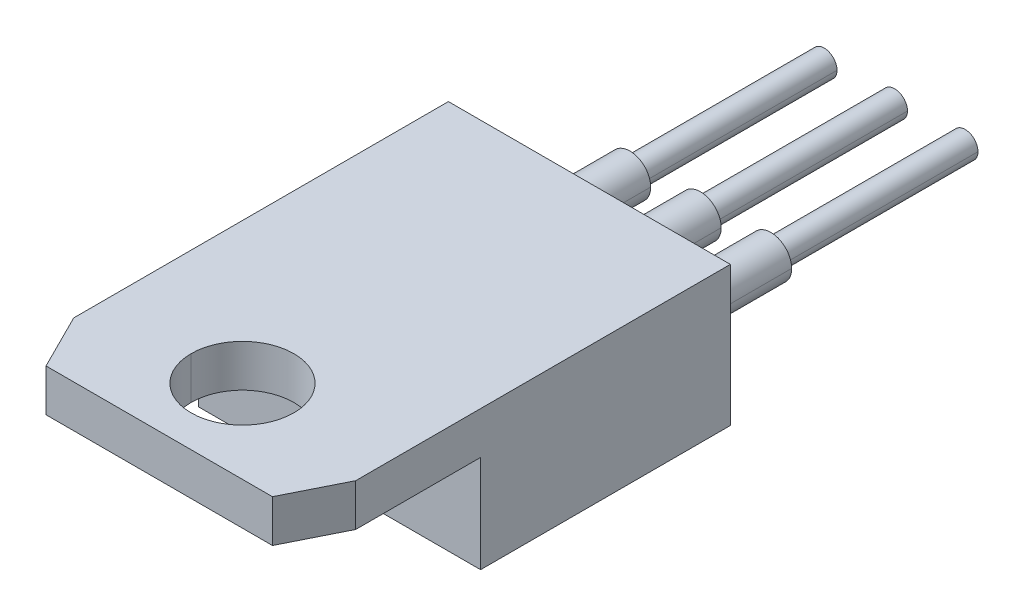
ISO-10303-21;
HEADER;
FILE_DESCRIPTION(('STEP AP214'),'2;1');
FILE_NAME('part.step','',(''),(''),'','','');
FILE_SCHEMA(('AUTOMOTIVE_DESIGN { 1 0 10303 214 1 1 1 1 }'));
ENDSEC;
DATA;
#1=APPLICATION_CONTEXT('core data for automotive mechanical design processes');
#2=APPLICATION_PROTOCOL_DEFINITION('international standard','automotive_design',2000,#1);
#3=PRODUCT_CONTEXT('',#1,'mechanical');
#4=PRODUCT('Part','Part','',(#3));
#5=PRODUCT_RELATED_PRODUCT_CATEGORY('part','',(#4));
#6=PRODUCT_DEFINITION_FORMATION('','',#4);
#7=PRODUCT_DEFINITION_CONTEXT('part definition',#1,'design');
#8=PRODUCT_DEFINITION('design','',#6,#7);
#9=PRODUCT_DEFINITION_SHAPE('','',#8);
#10=(LENGTH_UNIT() NAMED_UNIT(*) SI_UNIT(.MILLI.,.METRE.));
#11=(NAMED_UNIT(*) PLANE_ANGLE_UNIT() SI_UNIT($,.RADIAN.));
#12=(NAMED_UNIT(*) SI_UNIT($,.STERADIAN.) SOLID_ANGLE_UNIT());
#13=UNCERTAINTY_MEASURE_WITH_UNIT(LENGTH_MEASURE(1.E-05),#10,'distance_accuracy_value','');
#14=(GEOMETRIC_REPRESENTATION_CONTEXT(3) GLOBAL_UNCERTAINTY_ASSIGNED_CONTEXT((#13)) GLOBAL_UNIT_ASSIGNED_CONTEXT((#10,
#11,#12)) REPRESENTATION_CONTEXT('',''));
#15=CARTESIAN_POINT('',(0.,0.,0.));
#16=DIRECTION('',(0.,0.,1.));
#17=DIRECTION('',(1.,0.,0.));
#18=AXIS2_PLACEMENT_3D('',#15,#16,#17);
#19=CARTESIAN_POINT('',(3706.541863979,164.0918075982,-559.330297417));
#20=DIRECTION('',(0.,0.,1.));
#21=DIRECTION('',(1.,0.,0.));
#22=AXIS2_PLACEMENT_3D('',#19,#20,#21);
#23=CYLINDRICAL_SURFACE('',#22,0.75);
#24=CARTESIAN_POINT('',(3706.541863979,164.0918075982,-563.330297417));
#25=DIRECTION('',(0.,0.,1.));
#26=DIRECTION('',(-1.,-1.13686837721616E-13,0.));
#27=AXIS2_PLACEMENT_3D('',#24,#25,#26);
#28=CIRCLE('',#27,0.75);
#29=CARTESIAN_POINT('',(3705.791863979,164.0918075982,-563.330297417));
#30=VERTEX_POINT('',#29);
#31=CARTESIAN_POINT('',(3707.291863979,164.0918075982,-563.330297417));
#32=VERTEX_POINT('',#31);
#33=EDGE_CURVE('E25',#30,#32,#28,.T.);
#34=ORIENTED_EDGE('',*,*,#33,.T.);
#35=DIRECTION('',(0.,0.,1.));
#36=VECTOR('',#35,1.);
#37=CARTESIAN_POINT('',(3707.291863979,164.0918075982,-559.330297417));
#38=LINE('',#37,#36);
#39=CARTESIAN_POINT('',(3707.291863979,164.0918075982,-559.330297417));
#40=VERTEX_POINT('',#39);
#41=EDGE_CURVE('E424',#32,#40,#38,.T.);
#42=ORIENTED_EDGE('',*,*,#41,.T.);
#43=CARTESIAN_POINT('',(3706.541863979,164.0918075982,-559.330297417));
#44=DIRECTION('',(0.,0.,-1.));
#45=DIRECTION('',(1.,-1.13686837721616E-13,0.));
#46=AXIS2_PLACEMENT_3D('',#43,#44,#45);
#47=CIRCLE('',#46,0.75);
#48=CARTESIAN_POINT('',(3705.791863979,164.0918075982,-559.330297417));
#49=VERTEX_POINT('',#48);
#50=EDGE_CURVE('E359',#40,#49,#47,.T.);
#51=ORIENTED_EDGE('',*,*,#50,.T.);
#52=DIRECTION('',(0.,0.,1.));
#53=VECTOR('',#52,1.);
#54=CARTESIAN_POINT('',(3705.791863979,164.0918075982,-559.330297417));
#55=LINE('',#54,#53);
#56=EDGE_CURVE('E352',#30,#49,#55,.T.);
#57=ORIENTED_EDGE('',*,*,#56,.F.);
#58=EDGE_LOOP('',(#34,#42,#51,#57));
#59=FACE_BOUND('',#58,.T.);
#60=ADVANCED_FACE('F16',(#59),#23,.T.);
#61=CARTESIAN_POINT('',(3706.541863979,165.5904075982,-546.830297417));
#62=DIRECTION('',(0.,-1.,0.));
#63=DIRECTION('',(1.,0.,0.));
#64=AXIS2_PLACEMENT_3D('',#61,#62,#63);
#65=CYLINDRICAL_SURFACE('',#64,1.85);
#66=CARTESIAN_POINT('',(3706.541863979,167.1144075982,-546.830297417));
#67=DIRECTION('',(0.,1.,0.));
#68=DIRECTION('',(1.,0.,0.));
#69=AXIS2_PLACEMENT_3D('',#66,#67,#68);
#70=CIRCLE('',#69,1.85);
#71=CARTESIAN_POINT('',(3704.691863979,167.1144075982,-546.830297417));
#72=VERTEX_POINT('',#71);
#73=CARTESIAN_POINT('',(3708.391863979,167.1144075982,-546.830297417));
#74=VERTEX_POINT('',#73);
#75=EDGE_CURVE('E263',#72,#74,#70,.T.);
#76=ORIENTED_EDGE('',*,*,#75,.T.);
#77=DIRECTION('',(0.,-1.,0.));
#78=VECTOR('',#77,1.);
#79=CARTESIAN_POINT('',(3708.391863979,165.5904075982,-546.830297417));
#80=LINE('',#79,#78);
#81=CARTESIAN_POINT('',(3708.391863979,165.5904075982,-546.830297417));
#82=VERTEX_POINT('',#81);
#83=EDGE_CURVE('E318',#74,#82,#80,.T.);
#84=ORIENTED_EDGE('',*,*,#83,.T.);
#85=CARTESIAN_POINT('',(3706.541863979,165.5904075982,-546.830297417));
#86=DIRECTION('',(0.,-1.,0.));
#87=DIRECTION('',(-1.,0.,0.));
#88=AXIS2_PLACEMENT_3D('',#85,#86,#87);
#89=CIRCLE('',#88,1.85);
#90=CARTESIAN_POINT('',(3704.691863979,165.5904075982,-546.830297417));
#91=VERTEX_POINT('',#90);
#92=EDGE_CURVE('E308',#82,#91,#89,.T.);
#93=ORIENTED_EDGE('',*,*,#92,.T.);
#94=DIRECTION('',(0.,-1.,0.));
#95=VECTOR('',#94,1.);
#96=CARTESIAN_POINT('',(3704.691863979,165.5904075982,-546.830297417));
#97=LINE('',#96,#95);
#98=EDGE_CURVE('E314',#72,#91,#97,.T.);
#99=ORIENTED_EDGE('',*,*,#98,.F.);
#100=EDGE_LOOP('',(#76,#84,#93,#99));
#101=FACE_BOUND('',#100,.T.);
#102=ADVANCED_FACE('F457',(#101),#65,.F.);
#103=CARTESIAN_POINT('',(3704.001863979,164.0918075982,-559.330297417));
#104=DIRECTION('',(0.,0.,1.));
#105=DIRECTION('',(1.,0.,0.));
#106=AXIS2_PLACEMENT_3D('',#103,#104,#105);
#107=CYLINDRICAL_SURFACE('',#106,0.75);
#108=DIRECTION('',(0.,0.,1.));
#109=VECTOR('',#108,1.);
#110=CARTESIAN_POINT('',(3704.751863979,164.0918075982,-559.330297417));
#111=LINE('',#110,#109);
#112=CARTESIAN_POINT('',(3704.751863979,164.0918075982,-563.330297417));
#113=VERTEX_POINT('',#112);
#114=CARTESIAN_POINT('',(3704.751863979,164.0918075982,-559.330297417));
#115=VERTEX_POINT('',#114);
#116=EDGE_CURVE('E300',#113,#115,#111,.T.);
#117=ORIENTED_EDGE('',*,*,#116,.F.);
#118=CARTESIAN_POINT('',(3704.001863979,164.0918075982,-563.330297417));
#119=DIRECTION('',(0.,0.,1.));
#120=DIRECTION('',(-1.,-1.13686837721616E-13,0.));
#121=AXIS2_PLACEMENT_3D('',#118,#119,#120);
#122=CIRCLE('',#121,0.75);
#123=CARTESIAN_POINT('',(3703.251863979,164.0918075982,-563.330297417));
#124=VERTEX_POINT('',#123);
#125=EDGE_CURVE('E286',#113,#124,#122,.T.);
#126=ORIENTED_EDGE('',*,*,#125,.T.);
#127=DIRECTION('',(0.,0.,1.));
#128=VECTOR('',#127,1.);
#129=CARTESIAN_POINT('',(3703.251863979,164.0918075982,-559.330297417));
#130=LINE('',#129,#128);
#131=CARTESIAN_POINT('',(3703.251863979,164.0918075982,-559.330297417));
#132=VERTEX_POINT('',#131);
#133=EDGE_CURVE('E317',#124,#132,#130,.T.);
#134=ORIENTED_EDGE('',*,*,#133,.T.);
#135=CARTESIAN_POINT('',(3704.001863979,164.0918075982,-559.330297417));
#136=DIRECTION('',(0.,0.,-1.));
#137=DIRECTION('',(1.,-1.13686837721616E-13,0.));
#138=AXIS2_PLACEMENT_3D('',#135,#136,#137);
#139=CIRCLE('',#138,0.75);
#140=EDGE_CURVE('E351',#132,#115,#139,.T.);
#141=ORIENTED_EDGE('',*,*,#140,.T.);
#142=EDGE_LOOP('',(#117,#126,#134,#141));
#143=FACE_BOUND('',#142,.T.);
#144=ADVANCED_FACE('F462',(#143),#107,.T.);
#145=CARTESIAN_POINT('',(3709.081863979,164.0918075982,-559.330297417));
#146=DIRECTION('',(0.,0.,1.));
#147=DIRECTION('',(1.,0.,0.));
#148=AXIS2_PLACEMENT_3D('',#145,#146,#147);
#149=CYLINDRICAL_SURFACE('',#148,0.75);
#150=CARTESIAN_POINT('',(3709.081863979,164.0918075982,-563.330297417));
#151=DIRECTION('',(0.,0.,1.));
#152=DIRECTION('',(-1.,-1.13686837721616E-13,0.));
#153=AXIS2_PLACEMENT_3D('',#150,#151,#152);
#154=CIRCLE('',#153,0.75);
#155=CARTESIAN_POINT('',(3708.331863979,164.0918075982,-563.330297417));
#156=VERTEX_POINT('',#155);
#157=CARTESIAN_POINT('',(3709.831863979,164.0918075982,-563.330297417));
#158=VERTEX_POINT('',#157);
#159=EDGE_CURVE('E273',#156,#158,#154,.T.);
#160=ORIENTED_EDGE('',*,*,#159,.T.);
#161=DIRECTION('',(0.,0.,1.));
#162=VECTOR('',#161,1.);
#163=CARTESIAN_POINT('',(3709.831863979,164.0918075982,-559.330297417));
#164=LINE('',#163,#162);
#165=CARTESIAN_POINT('',(3709.831863979,164.0918075982,-559.330297417));
#166=VERTEX_POINT('',#165);
#167=EDGE_CURVE('E364',#158,#166,#164,.T.);
#168=ORIENTED_EDGE('',*,*,#167,.T.);
#169=CARTESIAN_POINT('',(3709.081863979,164.0918075982,-559.330297417));
#170=DIRECTION('',(0.,0.,-1.));
#171=DIRECTION('',(1.,-1.13686837721616E-13,0.));
#172=AXIS2_PLACEMENT_3D('',#169,#170,#171);
#173=CIRCLE('',#172,0.75);
#174=CARTESIAN_POINT('',(3708.331863979,164.0918075982,-559.330297417));
#175=VERTEX_POINT('',#174);
#176=EDGE_CURVE('E343',#166,#175,#173,.T.);
#177=ORIENTED_EDGE('',*,*,#176,.T.);
#178=DIRECTION('',(0.,0.,1.));
#179=VECTOR('',#178,1.);
#180=CARTESIAN_POINT('',(3708.331863979,164.0918075982,-559.330297417));
#181=LINE('',#180,#179);
#182=EDGE_CURVE('E277',#156,#175,#181,.T.);
#183=ORIENTED_EDGE('',*,*,#182,.F.);
#184=EDGE_LOOP('',(#160,#168,#177,#183));
#185=FACE_BOUND('',#184,.T.);
#186=ADVANCED_FACE('F468',(#185),#149,.T.);
#187=CARTESIAN_POINT('',(3706.541863979,164.0918075982,-559.330297417));
#188=DIRECTION('',(0.,0.,1.));
#189=DIRECTION('',(1.,0.,0.));
#190=AXIS2_PLACEMENT_3D('',#187,#188,#189);
#191=CYLINDRICAL_SURFACE('',#190,0.4635500000001);
#192=DIRECTION('',(0.,0.,1.));
#193=VECTOR('',#192,1.);
#194=CARTESIAN_POINT('',(3707.005413979,164.0918075982,-559.330297417));
#195=LINE('',#194,#193);
#196=CARTESIAN_POINT('',(3707.005413979,164.0918075982,-570.330297417));
#197=VERTEX_POINT('',#196);
#198=CARTESIAN_POINT('',(3707.005413979,164.0918075982,-563.330297417));
#199=VERTEX_POINT('',#198);
#200=EDGE_CURVE('E392',#197,#199,#195,.T.);
#201=ORIENTED_EDGE('',*,*,#200,.T.);
#202=CARTESIAN_POINT('',(3706.541863979,164.0918075982,-563.330297417));
#203=DIRECTION('',(0.,0.,-1.));
#204=DIRECTION('',(1.,-1.83939441896716E-13,0.));
#205=AXIS2_PLACEMENT_3D('',#202,#203,#204);
#206=CIRCLE('',#205,0.4635500000001);
#207=CARTESIAN_POINT('',(3706.078313979,164.0918075982,-563.330297417));
#208=VERTEX_POINT('',#207);
#209=EDGE_CURVE('E10',#199,#208,#206,.T.);
#210=ORIENTED_EDGE('',*,*,#209,.T.);
#211=DIRECTION('',(0.,0.,1.));
#212=VECTOR('',#211,1.);
#213=CARTESIAN_POINT('',(3706.078313979,164.0918075982,-559.330297417));
#214=LINE('',#213,#212);
#215=CARTESIAN_POINT('',(3706.078313979,164.0918075982,-570.330297417));
#216=VERTEX_POINT('',#215);
#217=EDGE_CURVE('E384',#216,#208,#214,.T.);
#218=ORIENTED_EDGE('',*,*,#217,.F.);
#219=CARTESIAN_POINT('',(3706.541863979,164.0918075982,-570.330297417));
#220=DIRECTION('',(0.,0.,1.));
#221=DIRECTION('',(-1.,-1.83939441896716E-13,0.));
#222=AXIS2_PLACEMENT_3D('',#219,#220,#221);
#223=CIRCLE('',#222,0.4635500000001);
#224=EDGE_CURVE('E271',#216,#197,#223,.T.);
#225=ORIENTED_EDGE('',*,*,#224,.T.);
#226=EDGE_LOOP('',(#201,#210,#218,#225));
#227=FACE_BOUND('',#226,.T.);
#228=ADVANCED_FACE('F472',(#227),#191,.T.);
#229=CARTESIAN_POINT('',(3704.001863979,164.0918075982,-559.330297417));
#230=DIRECTION('',(0.,0.,1.));
#231=DIRECTION('',(1.,0.,0.));
#232=AXIS2_PLACEMENT_3D('',#229,#230,#231);
#233=CYLINDRICAL_SURFACE('',#232,0.4635500000001);
#234=CARTESIAN_POINT('',(3704.001863979,164.0918075982,-570.330297417));
#235=DIRECTION('',(0.,0.,1.));
#236=DIRECTION('',(-1.,-1.83939441896716E-13,0.));
#237=AXIS2_PLACEMENT_3D('',#234,#235,#236);
#238=CIRCLE('',#237,0.4635500000001);
#239=CARTESIAN_POINT('',(3703.538313979,164.0918075982,-570.330297417));
#240=VERTEX_POINT('',#239);
#241=CARTESIAN_POINT('',(3704.465413979,164.0918075982,-570.330297417));
#242=VERTEX_POINT('',#241);
#243=EDGE_CURVE('E268',#240,#242,#238,.T.);
#244=ORIENTED_EDGE('',*,*,#243,.T.);
#245=DIRECTION('',(0.,0.,1.));
#246=VECTOR('',#245,1.);
#247=CARTESIAN_POINT('',(3704.465413979,164.0918075982,-559.330297417));
#248=LINE('',#247,#246);
#249=CARTESIAN_POINT('',(3704.465413979,164.0918075982,-563.330297417));
#250=VERTEX_POINT('',#249);
#251=EDGE_CURVE('E416',#242,#250,#248,.T.);
#252=ORIENTED_EDGE('',*,*,#251,.T.);
#253=CARTESIAN_POINT('',(3704.001863979,164.0918075982,-563.330297417));
#254=DIRECTION('',(0.,0.,-1.));
#255=DIRECTION('',(1.,-1.83939441896716E-13,0.));
#256=AXIS2_PLACEMENT_3D('',#253,#254,#255);
#257=CIRCLE('',#256,0.4635500000001);
#258=CARTESIAN_POINT('',(3703.538313979,164.0918075982,-563.330297417));
#259=VERTEX_POINT('',#258);
#260=EDGE_CURVE('E285',#250,#259,#257,.T.);
#261=ORIENTED_EDGE('',*,*,#260,.T.);
#262=DIRECTION('',(0.,0.,1.));
#263=VECTOR('',#262,1.);
#264=CARTESIAN_POINT('',(3703.538313979,164.0918075982,-559.330297417));
#265=LINE('',#264,#263);
#266=EDGE_CURVE('E272',#240,#259,#265,.T.);
#267=ORIENTED_EDGE('',*,*,#266,.F.);
#268=EDGE_LOOP('',(#244,#252,#261,#267));
#269=FACE_BOUND('',#268,.T.);
#270=ADVANCED_FACE('F451',(#269),#233,.T.);
#271=CARTESIAN_POINT('',(3709.081863979,164.0918075982,-559.330297417));
#272=DIRECTION('',(0.,0.,1.));
#273=DIRECTION('',(1.,0.,0.));
#274=AXIS2_PLACEMENT_3D('',#271,#272,#273);
#275=CYLINDRICAL_SURFACE('',#274,0.4635500000001);
#276=DIRECTION('',(0.,0.,1.));
#277=VECTOR('',#276,1.);
#278=CARTESIAN_POINT('',(3709.545413979,164.0918075982,-559.330297417));
#279=LINE('',#278,#277);
#280=CARTESIAN_POINT('',(3709.545413979,164.0918075982,-570.330297417));
#281=VERTEX_POINT('',#280);
#282=CARTESIAN_POINT('',(3709.545413979,164.0918075982,-563.330297417));
#283=VERTEX_POINT('',#282);
#284=EDGE_CURVE('E372',#281,#283,#279,.T.);
#285=ORIENTED_EDGE('',*,*,#284,.T.);
#286=CARTESIAN_POINT('',(3709.081863979,164.0918075982,-563.330297417));
#287=DIRECTION('',(0.,0.,-1.));
#288=DIRECTION('',(1.,-1.83939441896716E-13,0.));
#289=AXIS2_PLACEMENT_3D('',#286,#287,#288);
#290=CIRCLE('',#289,0.4635500000001);
#291=CARTESIAN_POINT('',(3708.618313979,164.0918075982,-563.330297417));
#292=VERTEX_POINT('',#291);
#293=EDGE_CURVE('E376',#283,#292,#290,.T.);
#294=ORIENTED_EDGE('',*,*,#293,.T.);
#295=DIRECTION('',(0.,0.,1.));
#296=VECTOR('',#295,1.);
#297=CARTESIAN_POINT('',(3708.618313979,164.0918075982,-559.330297417));
#298=LINE('',#297,#296);
#299=CARTESIAN_POINT('',(3708.618313979,164.0918075982,-570.330297417));
#300=VERTEX_POINT('',#299);
#301=EDGE_CURVE('E371',#300,#292,#298,.T.);
#302=ORIENTED_EDGE('',*,*,#301,.F.);
#303=CARTESIAN_POINT('',(3709.081863979,164.0918075982,-570.330297417));
#304=DIRECTION('',(0.,0.,1.));
#305=DIRECTION('',(-1.,-1.83939441896716E-13,0.));
#306=AXIS2_PLACEMENT_3D('',#303,#304,#305);
#307=CIRCLE('',#306,0.4635500000001);
#308=EDGE_CURVE('E400',#300,#281,#307,.T.);
#309=ORIENTED_EDGE('',*,*,#308,.T.);
#310=EDGE_LOOP('',(#285,#294,#302,#309));
#311=FACE_BOUND('',#310,.T.);
#312=ADVANCED_FACE('F440',(#311),#275,.T.);
#313=CARTESIAN_POINT('',(339.4764262862,745.8046419631,-563.330297417));
#314=DIRECTION('',(0.,0.,1.));
#315=DIRECTION('',(1.,0.,0.));
#316=AXIS2_PLACEMENT_3D('',#313,#314,#315);
#317=PLANE('',#316);
#318=CARTESIAN_POINT('',(3706.541863979,164.0918075982,-563.330297417));
#319=DIRECTION('',(0.,0.,-1.));
#320=DIRECTION('',(1.,-1.83939441896716E-13,0.));
#321=AXIS2_PLACEMENT_3D('',#318,#319,#320);
#322=CIRCLE('',#321,0.4635500000001);
#323=EDGE_CURVE('E388',#208,#199,#322,.T.);
#324=ORIENTED_EDGE('',*,*,#323,.F.);
#325=ORIENTED_EDGE('',*,*,#209,.F.);
#326=EDGE_LOOP('',(#324,#325));
#327=FACE_BOUND('',#326,.T.);
#328=ORIENTED_EDGE('',*,*,#33,.F.);
#329=CARTESIAN_POINT('',(3706.541863979,164.0918075982,-563.330297417));
#330=DIRECTION('',(0.,0.,1.));
#331=DIRECTION('',(-1.,-1.13686837721616E-13,0.));
#332=AXIS2_PLACEMENT_3D('',#329,#330,#331);
#333=CIRCLE('',#332,0.75);
#334=EDGE_CURVE('E19',#32,#30,#333,.T.);
#335=ORIENTED_EDGE('',*,*,#334,.F.);
#336=EDGE_LOOP('',(#328,#335));
#337=FACE_BOUND('',#336,.T.);
#338=ADVANCED_FACE('F438',(#327,#337),#317,.F.);
#339=CARTESIAN_POINT('',(3706.541863979,164.0918075982,-559.330297417));
#340=DIRECTION('',(0.,0.,1.));
#341=DIRECTION('',(1.,0.,0.));
#342=AXIS2_PLACEMENT_3D('',#339,#340,#341);
#343=CYLINDRICAL_SURFACE('',#342,0.75);
#344=CARTESIAN_POINT('',(3706.541863979,164.0918075982,-559.330297417));
#345=DIRECTION('',(0.,0.,-1.));
#346=DIRECTION('',(1.,-1.13686837721616E-13,0.));
#347=AXIS2_PLACEMENT_3D('',#344,#345,#346);
#348=CIRCLE('',#347,0.75);
#349=EDGE_CURVE('E355',#49,#40,#348,.T.);
#350=ORIENTED_EDGE('',*,*,#349,.T.);
#351=ORIENTED_EDGE('',*,*,#41,.F.);
#352=ORIENTED_EDGE('',*,*,#334,.T.);
#353=ORIENTED_EDGE('',*,*,#56,.T.);
#354=EDGE_LOOP('',(#350,#351,#352,#353));
#355=FACE_BOUND('',#354,.T.);
#356=ADVANCED_FACE('F437',(#355),#343,.T.);
#357=CARTESIAN_POINT('',(339.4764262862,745.8046419631,-570.330297417));
#358=DIRECTION('',(0.,0.,1.));
#359=DIRECTION('',(1.,0.,0.));
#360=AXIS2_PLACEMENT_3D('',#357,#358,#359);
#361=PLANE('',#360);
#362=CARTESIAN_POINT('',(3706.541863979,164.0918075982,-570.330297417));
#363=DIRECTION('',(0.,0.,1.));
#364=DIRECTION('',(-1.,-1.83939441896716E-13,0.));
#365=AXIS2_PLACEMENT_3D('',#362,#363,#364);
#366=CIRCLE('',#365,0.4635500000001);
#367=EDGE_CURVE('E380',#197,#216,#366,.T.);
#368=ORIENTED_EDGE('',*,*,#367,.F.);
#369=ORIENTED_EDGE('',*,*,#224,.F.);
#370=EDGE_LOOP('',(#368,#369));
#371=FACE_BOUND('',#370,.T.);
#372=ADVANCED_FACE('F449',(#371),#361,.F.);
#373=CARTESIAN_POINT('',(339.4764262862,745.8046419631,-570.330297417));
#374=DIRECTION('',(0.,0.,1.));
#375=DIRECTION('',(1.,0.,0.));
#376=AXIS2_PLACEMENT_3D('',#373,#374,#375);
#377=PLANE('',#376);
#378=ORIENTED_EDGE('',*,*,#243,.F.);
#379=CARTESIAN_POINT('',(3704.001863979,164.0918075982,-570.330297417));
#380=DIRECTION('',(0.,0.,1.));
#381=DIRECTION('',(-1.,-1.83939441896716E-13,0.));
#382=AXIS2_PLACEMENT_3D('',#379,#380,#381);
#383=CIRCLE('',#382,0.4635500000001);
#384=EDGE_CURVE('E417',#242,#240,#383,.T.);
#385=ORIENTED_EDGE('',*,*,#384,.F.);
#386=EDGE_LOOP('',(#378,#385));
#387=FACE_BOUND('',#386,.T.);
#388=ADVANCED_FACE('F485',(#387),#377,.F.);
#389=CARTESIAN_POINT('',(3704.001863979,164.0918075982,-559.330297417));
#390=DIRECTION('',(0.,0.,1.));
#391=DIRECTION('',(1.,0.,0.));
#392=AXIS2_PLACEMENT_3D('',#389,#390,#391);
#393=CYLINDRICAL_SURFACE('',#392,0.4635500000001);
#394=CARTESIAN_POINT('',(3704.001863979,164.0918075982,-563.330297417));
#395=DIRECTION('',(0.,0.,-1.));
#396=DIRECTION('',(1.,-1.83939441896716E-13,0.));
#397=AXIS2_PLACEMENT_3D('',#394,#395,#396);
#398=CIRCLE('',#397,0.4635500000001);
#399=EDGE_CURVE('E281',#259,#250,#398,.T.);
#400=ORIENTED_EDGE('',*,*,#399,.T.);
#401=ORIENTED_EDGE('',*,*,#251,.F.);
#402=ORIENTED_EDGE('',*,*,#384,.T.);
#403=ORIENTED_EDGE('',*,*,#266,.T.);
#404=EDGE_LOOP('',(#400,#401,#402,#403));
#405=FACE_BOUND('',#404,.T.);
#406=ADVANCED_FACE('F487',(#405),#393,.T.);
#407=CARTESIAN_POINT('',(3701.961863979,166.3524075982,-544.830297417));
#408=DIRECTION('',(0.894427190999896,0.,-0.447213595499998));
#409=DIRECTION('',(0.,-1.,0.));
#410=AXIS2_PLACEMENT_3D('',#407,#408,#409);
#411=PLANE('',#410);
#412=DIRECTION('',(0.,-1.,0.));
#413=VECTOR('',#412,1.);
#414=CARTESIAN_POINT('',(3702.461863979,167.1144075982,-543.830297417));
#415=LINE('',#414,#413);
#416=CARTESIAN_POINT('',(3702.461863979,167.1144075982,-543.830297417));
#417=VERTEX_POINT('',#416);
#418=CARTESIAN_POINT('',(3702.461863979,165.5904075982,-543.830297417));
#419=VERTEX_POINT('',#418);
#420=EDGE_CURVE('E517',#417,#419,#415,.T.);
#421=ORIENTED_EDGE('',*,*,#420,.F.);
#422=DIRECTION('',(-0.447213595499938,0.,-0.894427190999926));
#423=VECTOR('',#422,1.);
#424=CARTESIAN_POINT('',(3702.461863979,167.1144075982,-543.830297417));
#425=LINE('',#424,#423);
#426=CARTESIAN_POINT('',(3701.461863979,167.1144075982,-545.830297417));
#427=VERTEX_POINT('',#426);
#428=EDGE_CURVE('E227',#417,#427,#425,.T.);
#429=ORIENTED_EDGE('',*,*,#428,.T.);
#430=DIRECTION('',(0.,-1.,0.));
#431=VECTOR('',#430,1.);
#432=CARTESIAN_POINT('',(3701.461863979,167.1144075982,-545.830297417));
#433=LINE('',#432,#431);
#434=CARTESIAN_POINT('',(3701.461863979,165.5904075982,-545.830297417));
#435=VERTEX_POINT('',#434);
#436=EDGE_CURVE('E291',#427,#435,#433,.T.);
#437=ORIENTED_EDGE('',*,*,#436,.T.);
#438=DIRECTION('',(0.447213595499938,0.,0.894427190999926));
#439=VECTOR('',#438,1.);
#440=CARTESIAN_POINT('',(3701.461863979,165.5904075982,-545.830297417));
#441=LINE('',#440,#439);
#442=EDGE_CURVE('E309',#435,#419,#441,.T.);
#443=ORIENTED_EDGE('',*,*,#442,.T.);
#444=EDGE_LOOP('',(#421,#429,#437,#443));
#445=FACE_BOUND('',#444,.T.);
#446=ADVANCED_FACE('F861',(#445),#411,.F.);
#447=CARTESIAN_POINT('',(339.4764262862,745.8046419631,-563.330297417));
#448=DIRECTION('',(0.,0.,1.));
#449=DIRECTION('',(1.,0.,0.));
#450=AXIS2_PLACEMENT_3D('',#447,#448,#449);
#451=PLANE('',#450);
#452=ORIENTED_EDGE('',*,*,#399,.F.);
#453=ORIENTED_EDGE('',*,*,#260,.F.);
#454=EDGE_LOOP('',(#452,#453));
#455=FACE_BOUND('',#454,.T.);
#456=CARTESIAN_POINT('',(3704.001863979,164.0918075982,-563.330297417));
#457=DIRECTION('',(0.,0.,1.));
#458=DIRECTION('',(-1.,-1.13686837721616E-13,0.));
#459=AXIS2_PLACEMENT_3D('',#456,#457,#458);
#460=CIRCLE('',#459,0.75);
#461=EDGE_CURVE('E303',#124,#113,#460,.T.);
#462=ORIENTED_EDGE('',*,*,#461,.F.);
#463=ORIENTED_EDGE('',*,*,#125,.F.);
#464=EDGE_LOOP('',(#462,#463));
#465=FACE_BOUND('',#464,.T.);
#466=ADVANCED_FACE('F716',(#455,#465),#451,.F.);
#467=CARTESIAN_POINT('',(3704.001863979,164.0918075982,-559.330297417));
#468=DIRECTION('',(0.,0.,1.));
#469=DIRECTION('',(1.,0.,0.));
#470=AXIS2_PLACEMENT_3D('',#467,#468,#469);
#471=CYLINDRICAL_SURFACE('',#470,0.75);
#472=CARTESIAN_POINT('',(3704.001863979,164.0918075982,-559.330297417));
#473=DIRECTION('',(0.,0.,-1.));
#474=DIRECTION('',(1.,-1.13686837721616E-13,0.));
#475=AXIS2_PLACEMENT_3D('',#472,#473,#474);
#476=CIRCLE('',#475,0.75);
#477=EDGE_CURVE('E347',#115,#132,#476,.T.);
#478=ORIENTED_EDGE('',*,*,#477,.T.);
#479=ORIENTED_EDGE('',*,*,#133,.F.);
#480=ORIENTED_EDGE('',*,*,#461,.T.);
#481=ORIENTED_EDGE('',*,*,#116,.T.);
#482=EDGE_LOOP('',(#478,#479,#480,#481));
#483=FACE_BOUND('',#482,.T.);
#484=ADVANCED_FACE('F711',(#483),#471,.T.);
#485=CARTESIAN_POINT('',(3706.541863979,165.5904075982,-546.830297417));
#486=DIRECTION('',(0.,-1.,0.));
#487=DIRECTION('',(1.,0.,0.));
#488=AXIS2_PLACEMENT_3D('',#485,#486,#487);
#489=CYLINDRICAL_SURFACE('',#488,1.85);
#490=CARTESIAN_POINT('',(3706.541863979,165.5904075982,-546.830297417));
#491=DIRECTION('',(0.,-1.,0.));
#492=DIRECTION('',(-1.,0.,0.));
#493=AXIS2_PLACEMENT_3D('',#490,#491,#492);
#494=CIRCLE('',#493,1.85);
#495=EDGE_CURVE('E304',#91,#82,#494,.T.);
#496=ORIENTED_EDGE('',*,*,#495,.T.);
#497=ORIENTED_EDGE('',*,*,#83,.F.);
#498=CARTESIAN_POINT('',(3706.541863979,167.1144075982,-546.830297417));
#499=DIRECTION('',(0.,1.,0.));
#500=DIRECTION('',(1.,0.,0.));
#501=AXIS2_PLACEMENT_3D('',#498,#499,#500);
#502=CIRCLE('',#501,1.85);
#503=EDGE_CURVE('E267',#74,#72,#502,.T.);
#504=ORIENTED_EDGE('',*,*,#503,.T.);
#505=ORIENTED_EDGE('',*,*,#98,.T.);
#506=EDGE_LOOP('',(#496,#497,#504,#505));
#507=FACE_BOUND('',#506,.T.);
#508=ADVANCED_FACE('F715',(#507),#489,.F.);
#509=CARTESIAN_POINT('',(339.4764262862,745.8046419631,-570.330297417));
#510=DIRECTION('',(0.,0.,1.));
#511=DIRECTION('',(1.,0.,0.));
#512=AXIS2_PLACEMENT_3D('',#509,#510,#511);
#513=PLANE('',#512);
#514=CARTESIAN_POINT('',(3709.081863979,164.0918075982,-570.330297417));
#515=DIRECTION('',(0.,0.,1.));
#516=DIRECTION('',(-1.,-1.83939441896716E-13,0.));
#517=AXIS2_PLACEMENT_3D('',#514,#515,#516);
#518=CIRCLE('',#517,0.4635500000001);
#519=EDGE_CURVE('E367',#281,#300,#518,.T.);
#520=ORIENTED_EDGE('',*,*,#519,.F.);
#521=ORIENTED_EDGE('',*,*,#308,.F.);
#522=EDGE_LOOP('',(#520,#521));
#523=FACE_BOUND('',#522,.T.);
#524=ADVANCED_FACE('F728',(#523),#513,.F.);
#525=CARTESIAN_POINT('',(3709.081863979,164.0918075982,-559.330297417));
#526=DIRECTION('',(0.,0.,1.));
#527=DIRECTION('',(1.,0.,0.));
#528=AXIS2_PLACEMENT_3D('',#525,#526,#527);
#529=CYLINDRICAL_SURFACE('',#528,0.4635500000001);
#530=CARTESIAN_POINT('',(3709.081863979,164.0918075982,-563.330297417));
#531=DIRECTION('',(0.,0.,-1.));
#532=DIRECTION('',(1.,-1.83939441896716E-13,0.));
#533=AXIS2_PLACEMENT_3D('',#530,#531,#532);
#534=CIRCLE('',#533,0.4635500000001);
#535=EDGE_CURVE('E276',#292,#283,#534,.T.);
#536=ORIENTED_EDGE('',*,*,#535,.T.);
#537=ORIENTED_EDGE('',*,*,#284,.F.);
#538=ORIENTED_EDGE('',*,*,#519,.T.);
#539=ORIENTED_EDGE('',*,*,#301,.T.);
#540=EDGE_LOOP('',(#536,#537,#538,#539));
#541=FACE_BOUND('',#540,.T.);
#542=ADVANCED_FACE('F733',(#541),#529,.T.);
#543=CARTESIAN_POINT('',(3706.541863979,164.0918075982,-559.330297417));
#544=DIRECTION('',(0.,0.,1.));
#545=DIRECTION('',(1.,0.,0.));
#546=AXIS2_PLACEMENT_3D('',#543,#544,#545);
#547=CYLINDRICAL_SURFACE('',#546,0.4635500000001);
#548=ORIENTED_EDGE('',*,*,#367,.T.);
#549=ORIENTED_EDGE('',*,*,#217,.T.);
#550=ORIENTED_EDGE('',*,*,#323,.T.);
#551=ORIENTED_EDGE('',*,*,#200,.F.);
#552=EDGE_LOOP('',(#548,#549,#550,#551));
#553=FACE_BOUND('',#552,.T.);
#554=ADVANCED_FACE('F795',(#553),#547,.T.);
#555=CARTESIAN_POINT('',(339.4764262862,745.8046419631,-563.330297417));
#556=DIRECTION('',(0.,0.,1.));
#557=DIRECTION('',(1.,0.,0.));
#558=AXIS2_PLACEMENT_3D('',#555,#556,#557);
#559=PLANE('',#558);
#560=ORIENTED_EDGE('',*,*,#535,.F.);
#561=ORIENTED_EDGE('',*,*,#293,.F.);
#562=EDGE_LOOP('',(#560,#561));
#563=FACE_BOUND('',#562,.T.);
#564=ORIENTED_EDGE('',*,*,#159,.F.);
#565=CARTESIAN_POINT('',(3709.081863979,164.0918075982,-563.330297417));
#566=DIRECTION('',(0.,0.,1.));
#567=DIRECTION('',(-1.,-1.13686837721616E-13,0.));
#568=AXIS2_PLACEMENT_3D('',#565,#566,#567);
#569=CIRCLE('',#568,0.75);
#570=EDGE_CURVE('E360',#158,#156,#569,.T.);
#571=ORIENTED_EDGE('',*,*,#570,.F.);
#572=EDGE_LOOP('',(#564,#571));
#573=FACE_BOUND('',#572,.T.);
#574=ADVANCED_FACE('F770',(#563,#573),#559,.F.);
#575=CARTESIAN_POINT('',(3709.081863979,164.0918075982,-559.330297417));
#576=DIRECTION('',(0.,0.,1.));
#577=DIRECTION('',(1.,0.,0.));
#578=AXIS2_PLACEMENT_3D('',#575,#576,#577);
#579=CYLINDRICAL_SURFACE('',#578,0.75);
#580=CARTESIAN_POINT('',(3709.081863979,164.0918075982,-559.330297417));
#581=DIRECTION('',(0.,0.,-1.));
#582=DIRECTION('',(1.,-1.13686837721616E-13,0.));
#583=AXIS2_PLACEMENT_3D('',#580,#581,#582);
#584=CIRCLE('',#583,0.75);
#585=EDGE_CURVE('E324',#175,#166,#584,.T.);
#586=ORIENTED_EDGE('',*,*,#585,.T.);
#587=ORIENTED_EDGE('',*,*,#167,.F.);
#588=ORIENTED_EDGE('',*,*,#570,.T.);
#589=ORIENTED_EDGE('',*,*,#182,.T.);
#590=EDGE_LOOP('',(#586,#587,#588,#589));
#591=FACE_BOUND('',#590,.T.);
#592=ADVANCED_FACE('F764',(#591),#579,.T.);
#593=CARTESIAN_POINT('',(3711.621863979,162.0852075982,-559.330297417));
#594=DIRECTION('',(0.,-1.,0.));
#595=DIRECTION('',(0.,0.,-1.));
#596=AXIS2_PLACEMENT_3D('',#593,#594,#595);
#597=PLANE('',#596);
#598=DIRECTION('',(1.,0.,0.));
#599=VECTOR('',#598,1.);
#600=CARTESIAN_POINT('',(3701.461863979,162.0852075982,-559.330297417));
#601=LINE('',#600,#599);
#602=CARTESIAN_POINT('',(3701.461863979,162.0852075982,-559.330297417));
#603=VERTEX_POINT('',#602);
#604=CARTESIAN_POINT('',(3711.621863979,162.0852075982,-559.330297417));
#605=VERTEX_POINT('',#604);
#606=EDGE_CURVE('E321',#603,#605,#601,.T.);
#607=ORIENTED_EDGE('',*,*,#606,.T.);
#608=DIRECTION('',(0.,0.,-1.));
#609=VECTOR('',#608,1.);
#610=CARTESIAN_POINT('',(3711.621863979,162.0852075982,-550.330297417));
#611=LINE('',#610,#609);
#612=CARTESIAN_POINT('',(3711.621863979,162.0852075982,-550.330297417));
#613=VERTEX_POINT('',#612);
#614=EDGE_CURVE('E335',#613,#605,#611,.T.);
#615=ORIENTED_EDGE('',*,*,#614,.F.);
#616=DIRECTION('',(1.,0.,0.));
#617=VECTOR('',#616,1.);
#618=CARTESIAN_POINT('',(3701.461863979,162.0852075982,-550.330297417));
#619=LINE('',#618,#617);
#620=CARTESIAN_POINT('',(3701.461863979,162.0852075982,-550.330297417));
#621=VERTEX_POINT('',#620);
#622=EDGE_CURVE('E330',#621,#613,#619,.T.);
#623=ORIENTED_EDGE('',*,*,#622,.F.);
#624=DIRECTION('',(0.,0.,-1.));
#625=VECTOR('',#624,1.);
#626=CARTESIAN_POINT('',(3701.461863979,162.0852075982,-550.330297417));
#627=LINE('',#626,#625);
#628=EDGE_CURVE('E290',#621,#603,#627,.T.);
#629=ORIENTED_EDGE('',*,*,#628,.T.);
#630=EDGE_LOOP('',(#607,#615,#623,#629));
#631=FACE_BOUND('',#630,.T.);
#632=ADVANCED_FACE('F769',(#631),#597,.T.);
#633=CARTESIAN_POINT('',(339.4764262862,745.8046419631,-559.330297417));
#634=DIRECTION('',(0.,0.,1.));
#635=DIRECTION('',(1.,0.,0.));
#636=AXIS2_PLACEMENT_3D('',#633,#634,#635);
#637=PLANE('',#636);
#638=ORIENTED_EDGE('',*,*,#349,.F.);
#639=ORIENTED_EDGE('',*,*,#50,.F.);
#640=EDGE_LOOP('',(#638,#639));
#641=FACE_BOUND('',#640,.T.);
#642=ORIENTED_EDGE('',*,*,#477,.F.);
#643=ORIENTED_EDGE('',*,*,#140,.F.);
#644=EDGE_LOOP('',(#642,#643));
#645=FACE_BOUND('',#644,.T.);
#646=ORIENTED_EDGE('',*,*,#585,.F.);
#647=ORIENTED_EDGE('',*,*,#176,.F.);
#648=EDGE_LOOP('',(#646,#647));
#649=FACE_BOUND('',#648,.T.);
#650=DIRECTION('',(0.,-1.,0.));
#651=VECTOR('',#650,1.);
#652=CARTESIAN_POINT('',(3711.621863979,167.1144075982,-559.330297417));
#653=LINE('',#652,#651);
#654=CARTESIAN_POINT('',(3711.621863979,167.1144075982,-559.330297417));
#655=VERTEX_POINT('',#654);
#656=EDGE_CURVE('E221',#655,#605,#653,.T.);
#657=ORIENTED_EDGE('',*,*,#656,.T.);
#658=ORIENTED_EDGE('',*,*,#606,.F.);
#659=DIRECTION('',(0.,1.,0.));
#660=VECTOR('',#659,1.);
#661=CARTESIAN_POINT('',(3701.461863979,162.0852075982,-559.330297417));
#662=LINE('',#661,#660);
#663=CARTESIAN_POINT('',(3701.461863979,167.1144075982,-559.330297417));
#664=VERTEX_POINT('',#663);
#665=EDGE_CURVE('E287',#603,#664,#662,.T.);
#666=ORIENTED_EDGE('',*,*,#665,.T.);
#667=DIRECTION('',(1.,0.,0.));
#668=VECTOR('',#667,1.);
#669=CARTESIAN_POINT('',(3701.461863979,167.1144075982,-559.330297417));
#670=LINE('',#669,#668);
#671=EDGE_CURVE('E226',#664,#655,#670,.T.);
#672=ORIENTED_EDGE('',*,*,#671,.T.);
#673=EDGE_LOOP('',(#657,#658,#666,#672));
#674=FACE_BOUND('',#673,.T.);
#675=ADVANCED_FACE('F811',(#641,#645,#649,#674),#637,.F.);
#676=CARTESIAN_POINT('',(3711.621863979,167.1144075982,-559.330297417));
#677=DIRECTION('',(1.,0.,0.));
#678=DIRECTION('',(0.,1.,0.));
#679=AXIS2_PLACEMENT_3D('',#676,#677,#678);
#680=PLANE('',#679);
#681=DIRECTION('',(0.,0.,-1.));
#682=VECTOR('',#681,1.);
#683=CARTESIAN_POINT('',(3711.621863979,167.1144075982,-545.830297417));
#684=LINE('',#683,#682);
#685=CARTESIAN_POINT('',(3711.621863979,167.1144075982,-545.830297417));
#686=VERTEX_POINT('',#685);
#687=EDGE_CURVE('E212',#686,#655,#684,.T.);
#688=ORIENTED_EDGE('',*,*,#687,.F.);
#689=DIRECTION('',(0.,1.,0.));
#690=VECTOR('',#689,1.);
#691=CARTESIAN_POINT('',(3711.621863979,165.5904075982,-545.830297417));
#692=LINE('',#691,#690);
#693=CARTESIAN_POINT('',(3711.621863979,165.5904075982,-545.830297417));
#694=VERTEX_POINT('',#693);
#695=EDGE_CURVE('E217',#694,#686,#692,.T.);
#696=ORIENTED_EDGE('',*,*,#695,.F.);
#697=DIRECTION('',(0.,0.,-1.));
#698=VECTOR('',#697,1.);
#699=CARTESIAN_POINT('',(3711.621863979,165.5904075982,-545.830297417));
#700=LINE('',#699,#698);
#701=CARTESIAN_POINT('',(3711.621863979,165.5904075982,-550.330297417));
#702=VERTEX_POINT('',#701);
#703=EDGE_CURVE('E313',#694,#702,#700,.T.);
#704=ORIENTED_EDGE('',*,*,#703,.T.);
#705=DIRECTION('',(0.,1.,0.));
#706=VECTOR('',#705,1.);
#707=CARTESIAN_POINT('',(3711.621863979,162.0852075982,-550.330297417));
#708=LINE('',#707,#706);
#709=EDGE_CURVE('E334',#613,#702,#708,.T.);
#710=ORIENTED_EDGE('',*,*,#709,.F.);
#711=ORIENTED_EDGE('',*,*,#614,.T.);
#712=ORIENTED_EDGE('',*,*,#656,.F.);
#713=EDGE_LOOP('',(#688,#696,#704,#710,#711,#712));
#714=FACE_BOUND('',#713,.T.);
#715=ADVANCED_FACE('F214',(#714),#680,.T.);
#716=CARTESIAN_POINT('',(339.4764262862,745.8046419631,-550.330297417));
#717=DIRECTION('',(0.,0.,1.));
#718=DIRECTION('',(1.,0.,0.));
#719=AXIS2_PLACEMENT_3D('',#716,#717,#718);
#720=PLANE('',#719);
#721=DIRECTION('',(1.,0.,0.));
#722=VECTOR('',#721,1.);
#723=CARTESIAN_POINT('',(3701.461863979,165.5904075982,-550.330297417));
#724=LINE('',#723,#722);
#725=CARTESIAN_POINT('',(3701.461863979,165.5904075982,-550.330297417));
#726=VERTEX_POINT('',#725);
#727=EDGE_CURVE('E299',#726,#702,#724,.T.);
#728=ORIENTED_EDGE('',*,*,#727,.F.);
#729=DIRECTION('',(0.,-1.,0.));
#730=VECTOR('',#729,1.);
#731=CARTESIAN_POINT('',(3701.461863979,165.5904075982,-550.330297417));
#732=LINE('',#731,#730);
#733=EDGE_CURVE('E295',#726,#621,#732,.T.);
#734=ORIENTED_EDGE('',*,*,#733,.T.);
#735=ORIENTED_EDGE('',*,*,#622,.T.);
#736=ORIENTED_EDGE('',*,*,#709,.T.);
#737=EDGE_LOOP('',(#728,#734,#735,#736));
#738=FACE_BOUND('',#737,.T.);
#739=ADVANCED_FACE('F524',(#738),#720,.T.);
#740=CARTESIAN_POINT('',(3711.621863979,165.5904075982,-559.330297417));
#741=DIRECTION('',(0.,-1.,0.));
#742=DIRECTION('',(0.,0.,-1.));
#743=AXIS2_PLACEMENT_3D('',#740,#741,#742);
#744=PLANE('',#743);
#745=ORIENTED_EDGE('',*,*,#495,.F.);
#746=ORIENTED_EDGE('',*,*,#92,.F.);
#747=EDGE_LOOP('',(#745,#746));
#748=FACE_BOUND('',#747,.T.);
#749=ORIENTED_EDGE('',*,*,#727,.T.);
#750=ORIENTED_EDGE('',*,*,#703,.F.);
#751=DIRECTION('',(0.447213595499917,0.,-0.894427190999936));
#752=VECTOR('',#751,1.);
#753=CARTESIAN_POINT('',(3710.621863979,165.5904075982,-543.830297417));
#754=LINE('',#753,#752);
#755=CARTESIAN_POINT('',(3710.621863979,165.5904075982,-543.830297417));
#756=VERTEX_POINT('',#755);
#757=EDGE_CURVE('E242',#756,#694,#754,.T.);
#758=ORIENTED_EDGE('',*,*,#757,.F.);
#759=DIRECTION('',(1.,0.,0.));
#760=VECTOR('',#759,1.);
#761=CARTESIAN_POINT('',(3702.461863979,165.5904075982,-543.830297417));
#762=LINE('',#761,#760);
#763=EDGE_CURVE('E249',#419,#756,#762,.T.);
#764=ORIENTED_EDGE('',*,*,#763,.F.);
#765=ORIENTED_EDGE('',*,*,#442,.F.);
#766=DIRECTION('',(0.,0.,-1.));
#767=VECTOR('',#766,1.);
#768=CARTESIAN_POINT('',(3701.461863979,165.5904075982,-545.830297417));
#769=LINE('',#768,#767);
#770=EDGE_CURVE('E252',#435,#726,#769,.T.);
#771=ORIENTED_EDGE('',*,*,#770,.T.);
#772=EDGE_LOOP('',(#749,#750,#758,#764,#765,#771));
#773=FACE_BOUND('',#772,.T.);
#774=ADVANCED_FACE('F528',(#748,#773),#744,.T.);
#775=CARTESIAN_POINT('',(3701.461863979,165.5904075982,-559.330297417));
#776=DIRECTION('',(-1.,0.,0.));
#777=DIRECTION('',(0.,0.,1.));
#778=AXIS2_PLACEMENT_3D('',#775,#776,#777);
#779=PLANE('',#778);
#780=ORIENTED_EDGE('',*,*,#770,.F.);
#781=ORIENTED_EDGE('',*,*,#436,.F.);
#782=DIRECTION('',(0.,0.,-1.));
#783=VECTOR('',#782,1.);
#784=CARTESIAN_POINT('',(3701.461863979,167.1144075982,-545.830297417));
#785=LINE('',#784,#783);
#786=EDGE_CURVE('E239',#427,#664,#785,.T.);
#787=ORIENTED_EDGE('',*,*,#786,.T.);
#788=ORIENTED_EDGE('',*,*,#665,.F.);
#789=ORIENTED_EDGE('',*,*,#628,.F.);
#790=ORIENTED_EDGE('',*,*,#733,.F.);
#791=EDGE_LOOP('',(#780,#781,#787,#788,#789,#790));
#792=FACE_BOUND('',#791,.T.);
#793=ADVANCED_FACE('F758',(#792),#779,.T.);
#794=CARTESIAN_POINT('',(3701.461863979,167.1144075982,-559.330297417));
#795=DIRECTION('',(0.,1.,0.));
#796=DIRECTION('',(1.,0.,0.));
#797=AXIS2_PLACEMENT_3D('',#794,#795,#796);
#798=PLANE('',#797);
#799=ORIENTED_EDGE('',*,*,#75,.F.);
#800=ORIENTED_EDGE('',*,*,#503,.F.);
#801=EDGE_LOOP('',(#799,#800));
#802=FACE_BOUND('',#801,.T.);
#803=ORIENTED_EDGE('',*,*,#786,.F.);
#804=ORIENTED_EDGE('',*,*,#428,.F.);
#805=DIRECTION('',(-1.,0.,0.));
#806=VECTOR('',#805,1.);
#807=CARTESIAN_POINT('',(3710.621863979,167.1144075982,-543.830297417));
#808=LINE('',#807,#806);
#809=CARTESIAN_POINT('',(3710.621863979,167.1144075982,-543.830297417));
#810=VERTEX_POINT('',#809);
#811=EDGE_CURVE('E234',#810,#417,#808,.T.);
#812=ORIENTED_EDGE('',*,*,#811,.F.);
#813=DIRECTION('',(-0.447213595499978,0.,0.894427190999906));
#814=VECTOR('',#813,1.);
#815=CARTESIAN_POINT('',(3711.621863979,167.1144075982,-545.830297417));
#816=LINE('',#815,#814);
#817=EDGE_CURVE('E230',#686,#810,#816,.T.);
#818=ORIENTED_EDGE('',*,*,#817,.F.);
#819=ORIENTED_EDGE('',*,*,#687,.T.);
#820=ORIENTED_EDGE('',*,*,#671,.F.);
#821=EDGE_LOOP('',(#803,#804,#812,#818,#819,#820));
#822=FACE_BOUND('',#821,.T.);
#823=ADVANCED_FACE('F232',(#802,#822),#798,.T.);
#824=CARTESIAN_POINT('',(3711.121863979,166.3524075982,-544.830297417));
#825=DIRECTION('',(-0.894427190999896,0.,-0.447213595499998));
#826=DIRECTION('',(-0.447213595499998,0.,0.894427190999896));
#827=AXIS2_PLACEMENT_3D('',#824,#825,#826);
#828=PLANE('',#827);
#829=DIRECTION('',(0.,1.,0.));
#830=VECTOR('',#829,1.);
#831=CARTESIAN_POINT('',(3710.621863979,165.5904075982,-543.830297417));
#832=LINE('',#831,#830);
#833=EDGE_CURVE('E512',#756,#810,#832,.T.);
#834=ORIENTED_EDGE('',*,*,#833,.F.);
#835=ORIENTED_EDGE('',*,*,#757,.T.);
#836=ORIENTED_EDGE('',*,*,#695,.T.);
#837=ORIENTED_EDGE('',*,*,#817,.T.);
#838=EDGE_LOOP('',(#834,#835,#836,#837));
#839=FACE_BOUND('',#838,.T.);
#840=ADVANCED_FACE('F241',(#839),#828,.F.);
#841=CARTESIAN_POINT('',(339.4764262862,745.8046419631,-543.830297417));
#842=DIRECTION('',(0.,0.,1.));
#843=DIRECTION('',(1.,0.,0.));
#844=AXIS2_PLACEMENT_3D('',#841,#842,#843);
#845=PLANE('',#844);
#846=ORIENTED_EDGE('',*,*,#833,.T.);
#847=ORIENTED_EDGE('',*,*,#811,.T.);
#848=ORIENTED_EDGE('',*,*,#420,.T.);
#849=ORIENTED_EDGE('',*,*,#763,.T.);
#850=EDGE_LOOP('',(#846,#847,#848,#849));
#851=FACE_BOUND('',#850,.T.);
#852=ADVANCED_FACE('F683',(#851),#845,.T.);
#853=CLOSED_SHELL('',(#60,#102,#144,#186,#228,#270,#312,#338,#356,#372,#388,#406,#446,#466,#484,
#508,#524,#542,#554,#574,#592,#632,#675,#715,#739,#774,#793,#823,#840,#852));
#854=MANIFOLD_SOLID_BREP('B1',#853);
#855=ADVANCED_BREP_SHAPE_REPRESENTATION('',(#18,#854),#14);
#856=SHAPE_DEFINITION_REPRESENTATION(#9,#855);
ENDSEC;
END-ISO-10303-21;
